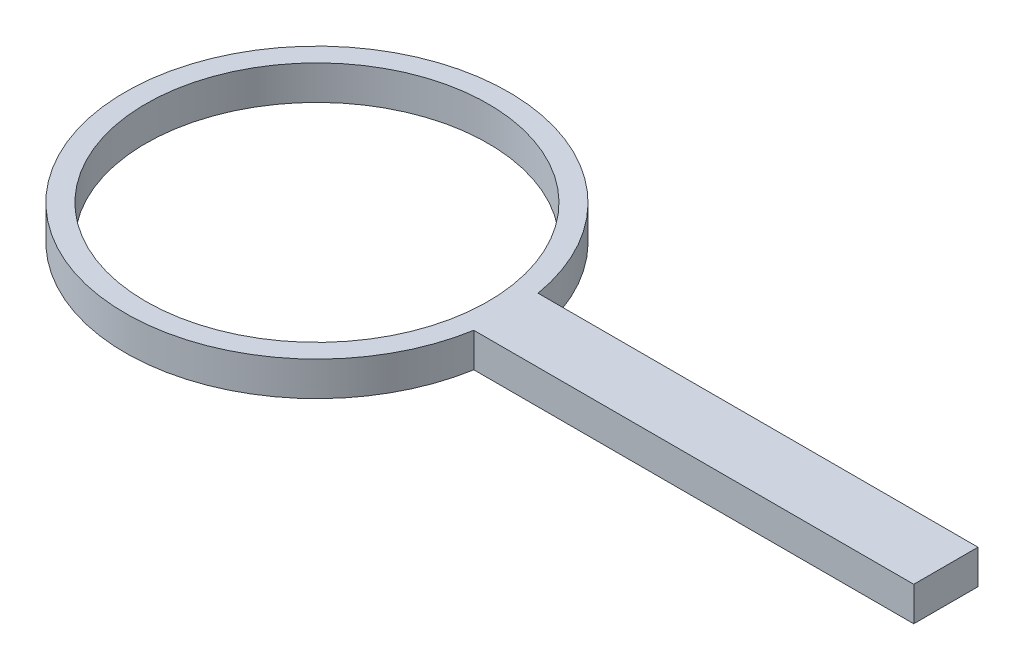
ISO-10303-21;
HEADER;
FILE_DESCRIPTION(('STEP AP214'),'2;1');
FILE_NAME('part.step','',(''),(''),'','','');
FILE_SCHEMA(('AUTOMOTIVE_DESIGN { 1 0 10303 214 1 1 1 1 }'));
ENDSEC;
DATA;
#1=APPLICATION_CONTEXT('core data for automotive mechanical design processes');
#2=APPLICATION_PROTOCOL_DEFINITION('international standard','automotive_design',2000,#1);
#3=PRODUCT_CONTEXT('',#1,'mechanical');
#4=PRODUCT('Part','Part','',(#3));
#5=PRODUCT_RELATED_PRODUCT_CATEGORY('part','',(#4));
#6=PRODUCT_DEFINITION_FORMATION('','',#4);
#7=PRODUCT_DEFINITION_CONTEXT('part definition',#1,'design');
#8=PRODUCT_DEFINITION('design','',#6,#7);
#9=PRODUCT_DEFINITION_SHAPE('','',#8);
#10=(LENGTH_UNIT() NAMED_UNIT(*) SI_UNIT(.MILLI.,.METRE.));
#11=(NAMED_UNIT(*) PLANE_ANGLE_UNIT() SI_UNIT($,.RADIAN.));
#12=(NAMED_UNIT(*) SI_UNIT($,.STERADIAN.) SOLID_ANGLE_UNIT());
#13=UNCERTAINTY_MEASURE_WITH_UNIT(LENGTH_MEASURE(1.E-05),#10,'distance_accuracy_value','');
#14=(GEOMETRIC_REPRESENTATION_CONTEXT(3) GLOBAL_UNCERTAINTY_ASSIGNED_CONTEXT((#13)) GLOBAL_UNIT_ASSIGNED_CONTEXT((#10,
#11,#12)) REPRESENTATION_CONTEXT('',''));
#15=CARTESIAN_POINT('',(0.,0.,0.));
#16=DIRECTION('',(0.,0.,1.));
#17=DIRECTION('',(1.,0.,0.));
#18=AXIS2_PLACEMENT_3D('',#15,#16,#17);
#19=CARTESIAN_POINT('',(-36.6072662231431,0.,0.));
#20=DIRECTION('',(0.,1.,0.));
#21=DIRECTION('',(0.,0.,1.));
#22=AXIS2_PLACEMENT_3D('',#19,#20,#21);
#23=CYLINDRICAL_SURFACE('',#22,28.);
#24=DIRECTION('',(0.,1.,0.));
#25=VECTOR('',#24,1.);
#26=CARTESIAN_POINT('',(-9.00307633845007,0.,4.69134317757813));
#27=LINE('',#26,#25);
#28=CARTESIAN_POINT('',(-9.00307633845007,5.,4.69134317757813));
#29=VERTEX_POINT('',#28);
#30=CARTESIAN_POINT('',(-9.00307633845007,0.,4.69134317757813));
#31=VERTEX_POINT('',#30);
#32=EDGE_CURVE('E55',#29,#31,#27,.F.);
#33=ORIENTED_EDGE('',*,*,#32,.F.);
#34=CARTESIAN_POINT('',(-36.6072662231431,5.,0.));
#35=DIRECTION('',(0.,1.,0.));
#36=DIRECTION('',(0.,0.,1.));
#37=AXIS2_PLACEMENT_3D('',#34,#35,#36);
#38=CIRCLE('',#37,28.);
#39=CARTESIAN_POINT('',(-9.00307633845007,5.,-4.69134317757813));
#40=VERTEX_POINT('',#39);
#41=EDGE_CURVE('E36',#40,#29,#38,.T.);
#42=ORIENTED_EDGE('',*,*,#41,.F.);
#43=DIRECTION('',(0.,1.,0.));
#44=VECTOR('',#43,1.);
#45=CARTESIAN_POINT('',(-9.00307633845007,0.,-4.69134317757813));
#46=LINE('',#45,#44);
#47=CARTESIAN_POINT('',(-9.00307633845007,0.,-4.69134317757813));
#48=VERTEX_POINT('',#47);
#49=EDGE_CURVE('E102',#48,#40,#46,.T.);
#50=ORIENTED_EDGE('',*,*,#49,.F.);
#51=CARTESIAN_POINT('',(-36.6072662231431,0.,0.));
#52=DIRECTION('',(0.,1.,0.));
#53=DIRECTION('',(0.,0.,1.));
#54=AXIS2_PLACEMENT_3D('',#51,#52,#53);
#55=CIRCLE('',#54,28.);
#56=EDGE_CURVE('E11',#48,#31,#55,.T.);
#57=ORIENTED_EDGE('',*,*,#56,.T.);
#58=EDGE_LOOP('',(#33,#42,#50,#57));
#59=FACE_BOUND('',#58,.T.);
#60=ADVANCED_FACE('F33',(#59),#23,.T.);
#61=CARTESIAN_POINT('',(-36.6072662231431,0.,0.));
#62=DIRECTION('',(0.,1.,0.));
#63=DIRECTION('',(0.,0.,1.));
#64=AXIS2_PLACEMENT_3D('',#61,#62,#63);
#65=PLANE('',#64);
#66=ORIENTED_EDGE('',*,*,#56,.F.);
#67=DIRECTION('',(-1.,0.,0.));
#68=VECTOR('',#67,1.);
#69=CARTESIAN_POINT('',(55.2547882008861,0.,-4.69134317757814));
#70=LINE('',#69,#68);
#71=CARTESIAN_POINT('',(55.2547882008861,0.,-4.69134317757814));
#72=VERTEX_POINT('',#71);
#73=EDGE_CURVE('E76',#72,#48,#70,.T.);
#74=ORIENTED_EDGE('',*,*,#73,.F.);
#75=DIRECTION('',(0.,0.,-1.));
#76=VECTOR('',#75,1.);
#77=CARTESIAN_POINT('',(55.2547882008861,0.,-4.69134317757814));
#78=LINE('',#77,#76);
#79=CARTESIAN_POINT('',(55.2547882008861,0.,4.69134317757812));
#80=VERTEX_POINT('',#79);
#81=EDGE_CURVE('E89',#80,#72,#78,.T.);
#82=ORIENTED_EDGE('',*,*,#81,.F.);
#83=DIRECTION('',(1.,0.,0.));
#84=VECTOR('',#83,1.);
#85=CARTESIAN_POINT('',(55.2547882008861,0.,4.69134317757812));
#86=LINE('',#85,#84);
#87=EDGE_CURVE('E82',#31,#80,#86,.T.);
#88=ORIENTED_EDGE('',*,*,#87,.F.);
#89=EDGE_LOOP('',(#66,#74,#82,#88));
#90=FACE_BOUND('',#89,.T.);
#91=CARTESIAN_POINT('',(-36.6072662231431,0.,0.));
#92=DIRECTION('',(0.,1.,0.));
#93=DIRECTION('',(0.,0.,1.));
#94=AXIS2_PLACEMENT_3D('',#91,#92,#93);
#95=CIRCLE('',#94,25.);
#96=CARTESIAN_POINT('',(-36.6072662231431,0.,25.));
#97=VERTEX_POINT('',#96);
#98=EDGE_CURVE('E109',#97,#97,#95,.T.);
#99=ORIENTED_EDGE('',*,*,#98,.T.);
#100=EDGE_LOOP('',(#99));
#101=FACE_BOUND('',#100,.T.);
#102=ADVANCED_FACE('F87',(#90,#101),#65,.F.);
#103=CARTESIAN_POINT('',(-36.6072662231431,5.,0.));
#104=DIRECTION('',(0.,1.,0.));
#105=DIRECTION('',(0.,0.,1.));
#106=AXIS2_PLACEMENT_3D('',#103,#104,#105);
#107=PLANE('',#106);
#108=ORIENTED_EDGE('',*,*,#41,.T.);
#109=DIRECTION('',(1.,0.,0.));
#110=VECTOR('',#109,1.);
#111=CARTESIAN_POINT('',(55.2547882008861,5.,4.69134317757812));
#112=LINE('',#111,#110);
#113=CARTESIAN_POINT('',(55.2547882008861,5.,4.69134317757812));
#114=VERTEX_POINT('',#113);
#115=EDGE_CURVE('E94',#29,#114,#112,.T.);
#116=ORIENTED_EDGE('',*,*,#115,.T.);
#117=DIRECTION('',(0.,0.,-1.));
#118=VECTOR('',#117,1.);
#119=CARTESIAN_POINT('',(55.2547882008861,5.,-4.69134317757814));
#120=LINE('',#119,#118);
#121=CARTESIAN_POINT('',(55.2547882008861,5.,-4.69134317757814));
#122=VERTEX_POINT('',#121);
#123=EDGE_CURVE('E99',#114,#122,#120,.T.);
#124=ORIENTED_EDGE('',*,*,#123,.T.);
#125=DIRECTION('',(-1.,0.,0.));
#126=VECTOR('',#125,1.);
#127=CARTESIAN_POINT('',(55.2547882008861,5.,-4.69134317757814));
#128=LINE('',#127,#126);
#129=EDGE_CURVE('E47',#122,#40,#128,.T.);
#130=ORIENTED_EDGE('',*,*,#129,.T.);
#131=EDGE_LOOP('',(#108,#116,#124,#130));
#132=FACE_BOUND('',#131,.T.);
#133=CARTESIAN_POINT('',(-36.6072662231431,5.,0.));
#134=DIRECTION('',(0.,1.,0.));
#135=DIRECTION('',(0.,0.,1.));
#136=AXIS2_PLACEMENT_3D('',#133,#134,#135);
#137=CIRCLE('',#136,25.);
#138=CARTESIAN_POINT('',(-36.6072662231431,5.,25.));
#139=VERTEX_POINT('',#138);
#140=EDGE_CURVE('E106',#139,#139,#137,.T.);
#141=ORIENTED_EDGE('',*,*,#140,.F.);
#142=EDGE_LOOP('',(#141));
#143=FACE_BOUND('',#142,.T.);
#144=ADVANCED_FACE('F113',(#132,#143),#107,.T.);
#145=CARTESIAN_POINT('',(-36.6072662231431,-5.,0.));
#146=DIRECTION('',(0.,1.,0.));
#147=DIRECTION('',(0.,0.,1.));
#148=AXIS2_PLACEMENT_3D('',#145,#146,#147);
#149=CYLINDRICAL_SURFACE('',#148,25.);
#150=ORIENTED_EDGE('',*,*,#140,.T.);
#151=EDGE_LOOP('',(#150));
#152=FACE_BOUND('',#151,.T.);
#153=ORIENTED_EDGE('',*,*,#98,.F.);
#154=EDGE_LOOP('',(#153));
#155=FACE_BOUND('',#154,.T.);
#156=ADVANCED_FACE('F124',(#152,#155),#149,.F.);
#157=CARTESIAN_POINT('',(55.2547882008861,0.,-4.69134317757814));
#158=DIRECTION('',(1.,0.,0.));
#159=DIRECTION('',(0.,0.,-1.));
#160=AXIS2_PLACEMENT_3D('',#157,#158,#159);
#161=PLANE('',#160);
#162=ORIENTED_EDGE('',*,*,#123,.F.);
#163=DIRECTION('',(0.,1.,0.));
#164=VECTOR('',#163,1.);
#165=CARTESIAN_POINT('',(55.2547882008861,0.,4.69134317757812));
#166=LINE('',#165,#164);
#167=EDGE_CURVE('E81',#80,#114,#166,.T.);
#168=ORIENTED_EDGE('',*,*,#167,.F.);
#169=ORIENTED_EDGE('',*,*,#81,.T.);
#170=DIRECTION('',(0.,1.,0.));
#171=VECTOR('',#170,1.);
#172=CARTESIAN_POINT('',(55.2547882008861,0.,-4.69134317757814));
#173=LINE('',#172,#171);
#174=EDGE_CURVE('E73',#72,#122,#173,.T.);
#175=ORIENTED_EDGE('',*,*,#174,.T.);
#176=EDGE_LOOP('',(#162,#168,#169,#175));
#177=FACE_BOUND('',#176,.T.);
#178=ADVANCED_FACE('F92',(#177),#161,.T.);
#179=CARTESIAN_POINT('',(55.2547882008861,0.,4.69134317757812));
#180=DIRECTION('',(0.,0.,1.));
#181=DIRECTION('',(1.,0.,0.));
#182=AXIS2_PLACEMENT_3D('',#179,#180,#181);
#183=PLANE('',#182);
#184=ORIENTED_EDGE('',*,*,#115,.F.);
#185=ORIENTED_EDGE('',*,*,#32,.T.);
#186=ORIENTED_EDGE('',*,*,#87,.T.);
#187=ORIENTED_EDGE('',*,*,#167,.T.);
#188=EDGE_LOOP('',(#184,#185,#186,#187));
#189=FACE_BOUND('',#188,.T.);
#190=ADVANCED_FACE('F131',(#189),#183,.T.);
#191=CARTESIAN_POINT('',(55.2547882008861,0.,-4.69134317757814));
#192=DIRECTION('',(0.,0.,-1.));
#193=DIRECTION('',(-1.,0.,0.));
#194=AXIS2_PLACEMENT_3D('',#191,#192,#193);
#195=PLANE('',#194);
#196=ORIENTED_EDGE('',*,*,#73,.T.);
#197=ORIENTED_EDGE('',*,*,#49,.T.);
#198=ORIENTED_EDGE('',*,*,#129,.F.);
#199=ORIENTED_EDGE('',*,*,#174,.F.);
#200=EDGE_LOOP('',(#196,#197,#198,#199));
#201=FACE_BOUND('',#200,.T.);
#202=ADVANCED_FACE('F75',(#201),#195,.T.);
#203=CLOSED_SHELL('',(#60,#102,#144,#156,#178,#190,#202));
#204=MANIFOLD_SOLID_BREP('B2',#203);
#205=ADVANCED_BREP_SHAPE_REPRESENTATION('',(#18,#204),#14);
#206=SHAPE_DEFINITION_REPRESENTATION(#9,#205);
ENDSEC;
END-ISO-10303-21;
